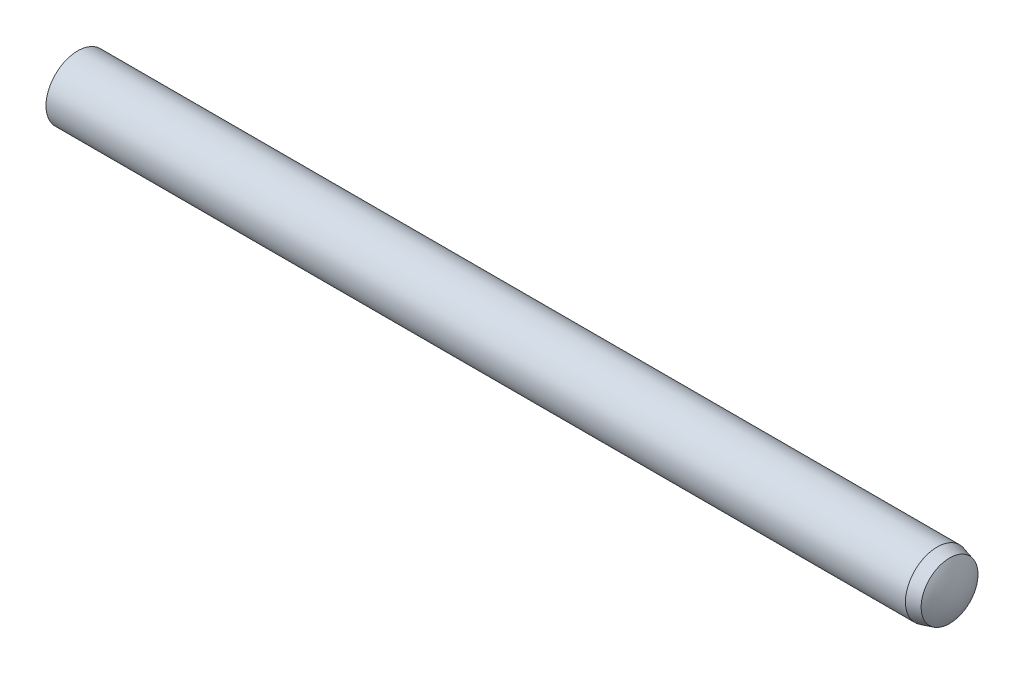
ISO-10303-21;
HEADER;
FILE_DESCRIPTION(('STEP AP214'),'2;1');
FILE_NAME('part.step','',(''),(''),'','','');
FILE_SCHEMA(('AUTOMOTIVE_DESIGN { 1 0 10303 214 1 1 1 1 }'));
ENDSEC;
DATA;
#1=APPLICATION_CONTEXT('core data for automotive mechanical design processes');
#2=APPLICATION_PROTOCOL_DEFINITION('international standard','automotive_design',2000,#1);
#3=PRODUCT_CONTEXT('',#1,'mechanical');
#4=PRODUCT('Part','Part','',(#3));
#5=PRODUCT_RELATED_PRODUCT_CATEGORY('part','',(#4));
#6=PRODUCT_DEFINITION_FORMATION('','',#4);
#7=PRODUCT_DEFINITION_CONTEXT('part definition',#1,'design');
#8=PRODUCT_DEFINITION('design','',#6,#7);
#9=PRODUCT_DEFINITION_SHAPE('','',#8);
#10=(LENGTH_UNIT() NAMED_UNIT(*) SI_UNIT(.MILLI.,.METRE.));
#11=(NAMED_UNIT(*) PLANE_ANGLE_UNIT() SI_UNIT($,.RADIAN.));
#12=(NAMED_UNIT(*) SI_UNIT($,.STERADIAN.) SOLID_ANGLE_UNIT());
#13=UNCERTAINTY_MEASURE_WITH_UNIT(LENGTH_MEASURE(1.E-05),#10,'distance_accuracy_value','');
#14=(GEOMETRIC_REPRESENTATION_CONTEXT(3) GLOBAL_UNCERTAINTY_ASSIGNED_CONTEXT((#13)) GLOBAL_UNIT_ASSIGNED_CONTEXT((#10,
#11,#12)) REPRESENTATION_CONTEXT('',''));
#15=CARTESIAN_POINT('',(0.,0.,0.));
#16=DIRECTION('',(0.,0.,1.));
#17=DIRECTION('',(1.,0.,0.));
#18=AXIS2_PLACEMENT_3D('',#15,#16,#17);
#19=CARTESIAN_POINT('',(-35.,0.,0.));
#20=DIRECTION('',(1.,0.,0.));
#21=DIRECTION('',(0.,0.,-1.));
#22=AXIS2_PLACEMENT_3D('',#19,#20,#21);
#23=CYLINDRICAL_SURFACE('',#22,2.5);
#24=CARTESIAN_POINT('',(33.375,0.,0.));
#25=DIRECTION('',(-1.,0.,0.));
#26=DIRECTION('',(0.,0.,1.));
#27=AXIS2_PLACEMENT_3D('',#24,#25,#26);
#28=CIRCLE('',#27,2.5);
#29=CARTESIAN_POINT('',(33.375,0.,2.5));
#30=VERTEX_POINT('',#29);
#31=EDGE_CURVE('E11',#30,#30,#28,.T.);
#32=ORIENTED_EDGE('',*,*,#31,.T.);
#33=EDGE_LOOP('',(#32));
#34=FACE_BOUND('',#33,.T.);
#35=CARTESIAN_POINT('',(-34.25,0.,0.));
#36=DIRECTION('',(-1.,0.,0.));
#37=DIRECTION('',(0.,0.,1.));
#38=AXIS2_PLACEMENT_3D('',#35,#36,#37);
#39=CIRCLE('',#38,2.5);
#40=CARTESIAN_POINT('',(-34.25,0.,2.5));
#41=VERTEX_POINT('',#40);
#42=EDGE_CURVE('E59',#41,#41,#39,.T.);
#43=ORIENTED_EDGE('',*,*,#42,.F.);
#44=EDGE_LOOP('',(#43));
#45=FACE_BOUND('',#44,.T.);
#46=ADVANCED_FACE('F39',(#34,#45),#23,.T.);
#47=CARTESIAN_POINT('',(33.375,0.,0.));
#48=DIRECTION('',(-1.,0.,0.));
#49=DIRECTION('',(0.,0.,1.));
#50=AXIS2_PLACEMENT_3D('',#47,#48,#49);
#51=CONICAL_SURFACE('',#50,2.5,0.26179938779915);
#52=CARTESIAN_POINT('',(34.35,0.,0.));
#53=DIRECTION('',(-1.,0.,0.));
#54=DIRECTION('',(0.,0.,1.));
#55=AXIS2_PLACEMENT_3D('',#52,#53,#54);
#56=CIRCLE('',#55,2.23874953737966);
#57=CARTESIAN_POINT('',(34.35,0.,2.23874953737966));
#58=VERTEX_POINT('',#57);
#59=EDGE_CURVE('E46',#58,#58,#56,.T.);
#60=ORIENTED_EDGE('',*,*,#59,.T.);
#61=EDGE_LOOP('',(#60));
#62=FACE_BOUND('',#61,.T.);
#63=ORIENTED_EDGE('',*,*,#31,.F.);
#64=EDGE_LOOP('',(#63));
#65=FACE_BOUND('',#64,.T.);
#66=ADVANCED_FACE('F65',(#62,#65),#51,.T.);
#67=CARTESIAN_POINT('',(30.8196157760634,0.,0.));
#68=DIRECTION('',(-1.,0.,0.));
#69=DIRECTION('',(0.,1.,0.));
#70=AXIS2_PLACEMENT_3D('',#67,#68,#69);
#71=SPHERICAL_SURFACE('',#70,4.18038422393658);
#72=CARTESIAN_POINT('',(35.,0.,0.));
#73=VERTEX_POINT('',#72);
#74=VERTEX_LOOP('',#73);
#75=FACE_BOUND('',#74,.T.);
#76=ORIENTED_EDGE('',*,*,#59,.F.);
#77=EDGE_LOOP('',(#76));
#78=FACE_BOUND('',#77,.T.);
#79=ADVANCED_FACE('F55',(#75,#78),#71,.T.);
#80=CARTESIAN_POINT('',(-30.4583333333333,0.,0.));
#81=DIRECTION('',(-1.,0.,0.));
#82=DIRECTION('',(0.,-1.,0.));
#83=AXIS2_PLACEMENT_3D('',#80,#81,#82);
#84=SPHERICAL_SURFACE('',#83,4.54166666666667);
#85=CARTESIAN_POINT('',(-35.,0.,0.));
#86=VERTEX_POINT('',#85);
#87=VERTEX_LOOP('',#86);
#88=FACE_BOUND('',#87,.T.);
#89=ORIENTED_EDGE('',*,*,#42,.T.);
#90=EDGE_LOOP('',(#89));
#91=FACE_BOUND('',#90,.T.);
#92=ADVANCED_FACE('F52',(#88,#91),#84,.T.);
#93=CLOSED_SHELL('',(#46,#66,#79,#92));
#94=MANIFOLD_SOLID_BREP('B2',#93);
#95=ADVANCED_BREP_SHAPE_REPRESENTATION('',(#18,#94),#14);
#96=SHAPE_DEFINITION_REPRESENTATION(#9,#95);
ENDSEC;
END-ISO-10303-21;
